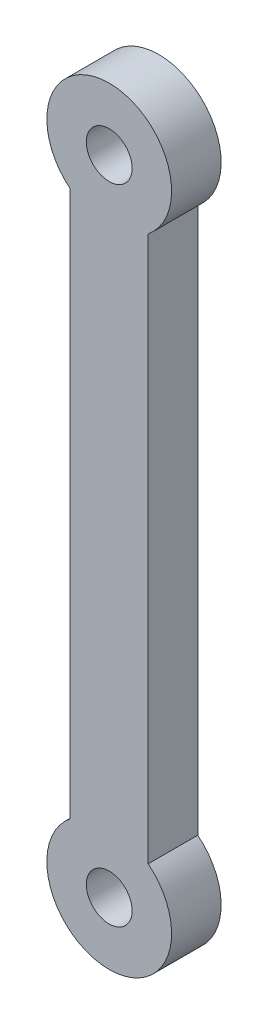
ISO-10303-21;
HEADER;
FILE_DESCRIPTION(('STEP AP214'),'2;1');
FILE_NAME('part.step','',(''),(''),'','','');
FILE_SCHEMA(('AUTOMOTIVE_DESIGN { 1 0 10303 214 1 1 1 1 }'));
ENDSEC;
DATA;
#1=APPLICATION_CONTEXT('core data for automotive mechanical design processes');
#2=APPLICATION_PROTOCOL_DEFINITION('international standard','automotive_design',2000,#1);
#3=PRODUCT_CONTEXT('',#1,'mechanical');
#4=PRODUCT('Part','Part','',(#3));
#5=PRODUCT_RELATED_PRODUCT_CATEGORY('part','',(#4));
#6=PRODUCT_DEFINITION_FORMATION('','',#4);
#7=PRODUCT_DEFINITION_CONTEXT('part definition',#1,'design');
#8=PRODUCT_DEFINITION('design','',#6,#7);
#9=PRODUCT_DEFINITION_SHAPE('','',#8);
#10=(LENGTH_UNIT() NAMED_UNIT(*) SI_UNIT(.MILLI.,.METRE.));
#11=(NAMED_UNIT(*) PLANE_ANGLE_UNIT() SI_UNIT($,.RADIAN.));
#12=(NAMED_UNIT(*) SI_UNIT($,.STERADIAN.) SOLID_ANGLE_UNIT());
#13=UNCERTAINTY_MEASURE_WITH_UNIT(LENGTH_MEASURE(1.E-05),#10,'distance_accuracy_value','');
#14=(GEOMETRIC_REPRESENTATION_CONTEXT(3) GLOBAL_UNCERTAINTY_ASSIGNED_CONTEXT((#13)) GLOBAL_UNIT_ASSIGNED_CONTEXT((#10,
#11,#12)) REPRESENTATION_CONTEXT('',''));
#15=CARTESIAN_POINT('',(0.,0.,0.));
#16=DIRECTION('',(0.,0.,1.));
#17=DIRECTION('',(1.,0.,0.));
#18=AXIS2_PLACEMENT_3D('',#15,#16,#17);
#19=CARTESIAN_POINT('',(0.,0.,3.18));
#20=DIRECTION('',(0.,0.,-1.));
#21=DIRECTION('',(-1.,0.,0.));
#22=AXIS2_PLACEMENT_3D('',#19,#20,#21);
#23=PLANE('',#22);
#24=CARTESIAN_POINT('',(0.,0.,3.18));
#25=DIRECTION('',(0.,0.,1.));
#26=DIRECTION('',(-1.,0.,0.));
#27=AXIS2_PLACEMENT_3D('',#24,#25,#26);
#28=CIRCLE('',#27,4.);
#29=CARTESIAN_POINT('',(-2.5,3.1224989991992,3.18));
#30=VERTEX_POINT('',#29);
#31=CARTESIAN_POINT('',(2.5,3.1224989991992,3.18));
#32=VERTEX_POINT('',#31);
#33=EDGE_CURVE('E50',#30,#32,#28,.T.);
#34=ORIENTED_EDGE('',*,*,#33,.T.);
#35=DIRECTION('',(0.,1.,0.));
#36=VECTOR('',#35,1.);
#37=CARTESIAN_POINT('',(2.5,3.1224989991992,3.18));
#38=LINE('',#37,#36);
#39=CARTESIAN_POINT('',(2.5,38.1224989991992,3.18));
#40=VERTEX_POINT('',#39);
#41=EDGE_CURVE('E80',#32,#40,#38,.T.);
#42=ORIENTED_EDGE('',*,*,#41,.T.);
#43=CARTESIAN_POINT('',(0.,41.2449979983984,3.18));
#44=DIRECTION('',(0.,0.,1.));
#45=DIRECTION('',(1.,0.,0.));
#46=AXIS2_PLACEMENT_3D('',#43,#44,#45);
#47=CIRCLE('',#46,4.);
#48=CARTESIAN_POINT('',(-2.5,38.1224989991992,3.18));
#49=VERTEX_POINT('',#48);
#50=EDGE_CURVE('E84',#40,#49,#47,.T.);
#51=ORIENTED_EDGE('',*,*,#50,.T.);
#52=DIRECTION('',(0.,-1.,0.));
#53=VECTOR('',#52,1.);
#54=CARTESIAN_POINT('',(-2.5,3.1224989991992,3.18));
#55=LINE('',#54,#53);
#56=EDGE_CURVE('E92',#49,#30,#55,.T.);
#57=ORIENTED_EDGE('',*,*,#56,.T.);
#58=EDGE_LOOP('',(#34,#42,#51,#57));
#59=FACE_BOUND('',#58,.T.);
#60=CARTESIAN_POINT('',(0.,41.2449979983984,3.18));
#61=DIRECTION('',(0.,0.,1.));
#62=DIRECTION('',(1.,0.,0.));
#63=AXIS2_PLACEMENT_3D('',#60,#61,#62);
#64=CIRCLE('',#63,1.47);
#65=CARTESIAN_POINT('',(-1.47,41.2449979983984,3.18));
#66=VERTEX_POINT('',#65);
#67=EDGE_CURVE('E99',#66,#66,#64,.T.);
#68=ORIENTED_EDGE('',*,*,#67,.F.);
#69=EDGE_LOOP('',(#68));
#70=FACE_BOUND('',#69,.T.);
#71=CARTESIAN_POINT('',(0.,0.,3.18));
#72=DIRECTION('',(0.,0.,1.));
#73=DIRECTION('',(1.,0.,0.));
#74=AXIS2_PLACEMENT_3D('',#71,#72,#73);
#75=CIRCLE('',#74,1.47);
#76=CARTESIAN_POINT('',(-1.47,0.,3.18));
#77=VERTEX_POINT('',#76);
#78=EDGE_CURVE('E137',#77,#77,#75,.T.);
#79=ORIENTED_EDGE('',*,*,#78,.F.);
#80=EDGE_LOOP('',(#79));
#81=FACE_BOUND('',#80,.T.);
#82=ADVANCED_FACE('F33',(#59,#70,#81),#23,.F.);
#83=CARTESIAN_POINT('',(0.,0.,0.));
#84=DIRECTION('',(0.,0.,-1.));
#85=DIRECTION('',(-1.,0.,0.));
#86=AXIS2_PLACEMENT_3D('',#83,#84,#85);
#87=PLANE('',#86);
#88=CARTESIAN_POINT('',(0.,41.2449979983984,0.));
#89=DIRECTION('',(0.,0.,1.));
#90=DIRECTION('',(1.,0.,0.));
#91=AXIS2_PLACEMENT_3D('',#88,#89,#90);
#92=CIRCLE('',#91,1.47);
#93=CARTESIAN_POINT('',(-1.47,41.2449979983984,0.));
#94=VERTEX_POINT('',#93);
#95=EDGE_CURVE('E142',#94,#94,#92,.T.);
#96=ORIENTED_EDGE('',*,*,#95,.T.);
#97=EDGE_LOOP('',(#96));
#98=FACE_BOUND('',#97,.T.);
#99=DIRECTION('',(0.,1.,0.));
#100=VECTOR('',#99,1.);
#101=CARTESIAN_POINT('',(2.5,3.1224989991992,0.));
#102=LINE('',#101,#100);
#103=CARTESIAN_POINT('',(2.5,3.1224989991992,0.));
#104=VERTEX_POINT('',#103);
#105=CARTESIAN_POINT('',(2.5,38.1224989991992,0.));
#106=VERTEX_POINT('',#105);
#107=EDGE_CURVE('E88',#104,#106,#102,.T.);
#108=ORIENTED_EDGE('',*,*,#107,.F.);
#109=CARTESIAN_POINT('',(0.,0.,0.));
#110=DIRECTION('',(0.,0.,1.));
#111=DIRECTION('',(1.,0.,0.));
#112=AXIS2_PLACEMENT_3D('',#109,#110,#111);
#113=CIRCLE('',#112,4.);
#114=CARTESIAN_POINT('',(-2.5,3.1224989991992,0.));
#115=VERTEX_POINT('',#114);
#116=EDGE_CURVE('E102',#115,#104,#113,.T.);
#117=ORIENTED_EDGE('',*,*,#116,.F.);
#118=DIRECTION('',(0.,-1.,0.));
#119=VECTOR('',#118,1.);
#120=CARTESIAN_POINT('',(-2.5,3.1224989991992,0.));
#121=LINE('',#120,#119);
#122=CARTESIAN_POINT('',(-2.5,38.1224989991992,0.));
#123=VERTEX_POINT('',#122);
#124=EDGE_CURVE('E75',#123,#115,#121,.T.);
#125=ORIENTED_EDGE('',*,*,#124,.F.);
#126=CARTESIAN_POINT('',(0.,41.2449979983984,0.));
#127=DIRECTION('',(0.,0.,1.));
#128=DIRECTION('',(1.,0.,0.));
#129=AXIS2_PLACEMENT_3D('',#126,#127,#128);
#130=CIRCLE('',#129,4.);
#131=EDGE_CURVE('E68',#106,#123,#130,.T.);
#132=ORIENTED_EDGE('',*,*,#131,.F.);
#133=EDGE_LOOP('',(#108,#117,#125,#132));
#134=FACE_BOUND('',#133,.T.);
#135=CARTESIAN_POINT('',(0.,0.,0.));
#136=DIRECTION('',(0.,0.,1.));
#137=DIRECTION('',(1.,0.,0.));
#138=AXIS2_PLACEMENT_3D('',#135,#136,#137);
#139=CIRCLE('',#138,1.47);
#140=CARTESIAN_POINT('',(-1.47,0.,0.));
#141=VERTEX_POINT('',#140);
#142=EDGE_CURVE('E140',#141,#141,#139,.T.);
#143=ORIENTED_EDGE('',*,*,#142,.T.);
#144=EDGE_LOOP('',(#143));
#145=FACE_BOUND('',#144,.T.);
#146=ADVANCED_FACE('F108',(#98,#134,#145),#87,.T.);
#147=CARTESIAN_POINT('',(2.5,3.1224989991992,3.18));
#148=DIRECTION('',(-1.,0.,0.));
#149=DIRECTION('',(0.,-1.,0.));
#150=AXIS2_PLACEMENT_3D('',#147,#148,#149);
#151=PLANE('',#150);
#152=ORIENTED_EDGE('',*,*,#107,.T.);
#153=DIRECTION('',(0.,0.,-1.));
#154=VECTOR('',#153,1.);
#155=CARTESIAN_POINT('',(2.5,38.1224989991992,3.18));
#156=LINE('',#155,#154);
#157=EDGE_CURVE('E42',#40,#106,#156,.T.);
#158=ORIENTED_EDGE('',*,*,#157,.F.);
#159=ORIENTED_EDGE('',*,*,#41,.F.);
#160=DIRECTION('',(0.,0.,-1.));
#161=VECTOR('',#160,1.);
#162=CARTESIAN_POINT('',(2.5,3.1224989991992,3.18));
#163=LINE('',#162,#161);
#164=EDGE_CURVE('E11',#32,#104,#163,.T.);
#165=ORIENTED_EDGE('',*,*,#164,.T.);
#166=EDGE_LOOP('',(#152,#158,#159,#165));
#167=FACE_BOUND('',#166,.T.);
#168=ADVANCED_FACE('F35',(#167),#151,.F.);
#169=CARTESIAN_POINT('',(0.,41.2449979983984,3.18));
#170=DIRECTION('',(0.,0.,-1.));
#171=DIRECTION('',(-1.,0.,0.));
#172=AXIS2_PLACEMENT_3D('',#169,#170,#171);
#173=CYLINDRICAL_SURFACE('',#172,4.);
#174=ORIENTED_EDGE('',*,*,#131,.T.);
#175=DIRECTION('',(0.,0.,-1.));
#176=VECTOR('',#175,1.);
#177=CARTESIAN_POINT('',(-2.5,38.1224989991992,3.18));
#178=LINE('',#177,#176);
#179=EDGE_CURVE('E89',#49,#123,#178,.T.);
#180=ORIENTED_EDGE('',*,*,#179,.F.);
#181=ORIENTED_EDGE('',*,*,#50,.F.);
#182=ORIENTED_EDGE('',*,*,#157,.T.);
#183=EDGE_LOOP('',(#174,#180,#181,#182));
#184=FACE_BOUND('',#183,.T.);
#185=ADVANCED_FACE('F90',(#184),#173,.T.);
#186=CARTESIAN_POINT('',(-2.5,3.1224989991992,3.18));
#187=DIRECTION('',(1.,0.,0.));
#188=DIRECTION('',(0.,1.,0.));
#189=AXIS2_PLACEMENT_3D('',#186,#187,#188);
#190=PLANE('',#189);
#191=ORIENTED_EDGE('',*,*,#124,.T.);
#192=DIRECTION('',(0.,0.,-1.));
#193=VECTOR('',#192,1.);
#194=CARTESIAN_POINT('',(-2.5,3.1224989991992,3.18));
#195=LINE('',#194,#193);
#196=EDGE_CURVE('E94',#30,#115,#195,.T.);
#197=ORIENTED_EDGE('',*,*,#196,.F.);
#198=ORIENTED_EDGE('',*,*,#56,.F.);
#199=ORIENTED_EDGE('',*,*,#179,.T.);
#200=EDGE_LOOP('',(#191,#197,#198,#199));
#201=FACE_BOUND('',#200,.T.);
#202=ADVANCED_FACE('F105',(#201),#190,.F.);
#203=CARTESIAN_POINT('',(0.,0.,3.18));
#204=DIRECTION('',(0.,0.,-1.));
#205=DIRECTION('',(-1.,0.,0.));
#206=AXIS2_PLACEMENT_3D('',#203,#204,#205);
#207=CYLINDRICAL_SURFACE('',#206,4.);
#208=ORIENTED_EDGE('',*,*,#116,.T.);
#209=ORIENTED_EDGE('',*,*,#164,.F.);
#210=ORIENTED_EDGE('',*,*,#33,.F.);
#211=ORIENTED_EDGE('',*,*,#196,.T.);
#212=EDGE_LOOP('',(#208,#209,#210,#211));
#213=FACE_BOUND('',#212,.T.);
#214=ADVANCED_FACE('F110',(#213),#207,.T.);
#215=CARTESIAN_POINT('',(0.,41.2449979983984,3.18));
#216=DIRECTION('',(0.,0.,-1.));
#217=DIRECTION('',(-1.,0.,0.));
#218=AXIS2_PLACEMENT_3D('',#215,#216,#217);
#219=CYLINDRICAL_SURFACE('',#218,1.47);
#220=CARTESIAN_POINT('',(-1.47,41.2449979983984,3.18));
#221=CARTESIAN_POINT('',(-1.47,41.2449979983984,3.146875));
#222=CARTESIAN_POINT('',(-1.47,41.2449979983984,3.11375));
#223=CARTESIAN_POINT('',(-1.47,41.2449979983984,3.0475));
#224=CARTESIAN_POINT('',(-1.47,41.2449979983984,3.014375));
#225=CARTESIAN_POINT('',(-1.47,41.2449979983984,2.948125));
#226=CARTESIAN_POINT('',(-1.47,41.2449979983984,2.915));
#227=CARTESIAN_POINT('',(-1.47,41.2449979983984,2.84875));
#228=CARTESIAN_POINT('',(-1.47,41.2449979983984,2.815625));
#229=CARTESIAN_POINT('',(-1.47,41.2449979983984,2.749375));
#230=CARTESIAN_POINT('',(-1.47,41.2449979983984,2.71625));
#231=CARTESIAN_POINT('',(-1.47,41.2449979983984,2.65));
#232=CARTESIAN_POINT('',(-1.47,41.2449979983984,2.616875));
#233=CARTESIAN_POINT('',(-1.47,41.2449979983984,2.550625));
#234=CARTESIAN_POINT('',(-1.47,41.2449979983984,2.5175));
#235=CARTESIAN_POINT('',(-1.47,41.2449979983984,2.45125));
#236=CARTESIAN_POINT('',(-1.47,41.2449979983984,2.418125));
#237=CARTESIAN_POINT('',(-1.47,41.2449979983984,2.351875));
#238=CARTESIAN_POINT('',(-1.47,41.2449979983984,2.31875));
#239=CARTESIAN_POINT('',(-1.47,41.2449979983984,2.2525));
#240=CARTESIAN_POINT('',(-1.47,41.2449979983984,2.219375));
#241=CARTESIAN_POINT('',(-1.47,41.2449979983984,2.153125));
#242=CARTESIAN_POINT('',(-1.47,41.2449979983984,2.12));
#243=CARTESIAN_POINT('',(-1.47,41.2449979983984,2.05375));
#244=CARTESIAN_POINT('',(-1.47,41.2449979983984,2.020625));
#245=CARTESIAN_POINT('',(-1.47,41.2449979983984,1.954375));
#246=CARTESIAN_POINT('',(-1.47,41.2449979983984,1.92125));
#247=CARTESIAN_POINT('',(-1.47,41.2449979983984,1.855));
#248=CARTESIAN_POINT('',(-1.47,41.2449979983984,1.821875));
#249=CARTESIAN_POINT('',(-1.47,41.2449979983984,1.755625));
#250=CARTESIAN_POINT('',(-1.47,41.2449979983984,1.7225));
#251=CARTESIAN_POINT('',(-1.47,41.2449979983984,1.65625));
#252=CARTESIAN_POINT('',(-1.47,41.2449979983984,1.623125));
#253=CARTESIAN_POINT('',(-1.47,41.2449979983984,1.556875));
#254=CARTESIAN_POINT('',(-1.47,41.2449979983984,1.52375));
#255=CARTESIAN_POINT('',(-1.47,41.2449979983984,1.4575));
#256=CARTESIAN_POINT('',(-1.47,41.2449979983984,1.424375));
#257=CARTESIAN_POINT('',(-1.47,41.2449979983984,1.358125));
#258=CARTESIAN_POINT('',(-1.47,41.2449979983984,1.325));
#259=CARTESIAN_POINT('',(-1.47,41.2449979983984,1.25875));
#260=CARTESIAN_POINT('',(-1.47,41.2449979983984,1.225625));
#261=CARTESIAN_POINT('',(-1.47,41.2449979983984,1.159375));
#262=CARTESIAN_POINT('',(-1.47,41.2449979983984,1.12625));
#263=CARTESIAN_POINT('',(-1.47,41.2449979983984,1.06));
#264=CARTESIAN_POINT('',(-1.47,41.2449979983984,1.026875));
#265=CARTESIAN_POINT('',(-1.47,41.2449979983984,0.960625));
#266=CARTESIAN_POINT('',(-1.47,41.2449979983984,0.9275));
#267=CARTESIAN_POINT('',(-1.47,41.2449979983984,0.86125));
#268=CARTESIAN_POINT('',(-1.47,41.2449979983984,0.828125));
#269=CARTESIAN_POINT('',(-1.47,41.2449979983984,0.761875));
#270=CARTESIAN_POINT('',(-1.47,41.2449979983984,0.72875));
#271=CARTESIAN_POINT('',(-1.47,41.2449979983984,0.6625));
#272=CARTESIAN_POINT('',(-1.47,41.2449979983984,0.629375));
#273=CARTESIAN_POINT('',(-1.47,41.2449979983984,0.563125));
#274=CARTESIAN_POINT('',(-1.47,41.2449979983984,0.53));
#275=CARTESIAN_POINT('',(-1.47,41.2449979983984,0.46375));
#276=CARTESIAN_POINT('',(-1.47,41.2449979983984,0.430625));
#277=CARTESIAN_POINT('',(-1.47,41.2449979983984,0.364375));
#278=CARTESIAN_POINT('',(-1.47,41.2449979983984,0.33125));
#279=CARTESIAN_POINT('',(-1.47,41.2449979983984,0.265));
#280=CARTESIAN_POINT('',(-1.47,41.2449979983984,0.231875));
#281=CARTESIAN_POINT('',(-1.47,41.2449979983984,0.165625));
#282=CARTESIAN_POINT('',(-1.47,41.2449979983984,0.1325));
#283=CARTESIAN_POINT('',(-1.47,41.2449979983984,0.06625));
#284=CARTESIAN_POINT('',(-1.47,41.2449979983984,0.033125));
#285=CARTESIAN_POINT('',(-1.47,41.2449979983984,0.));
#286=B_SPLINE_CURVE_WITH_KNOTS('',3,(#220,#221,#222,#223,#224,#225,#226,#227,#228,#229,#230,
#231,#232,#233,#234,#235,#236,#237,#238,#239,#240,#241,#242,#243,#244,#245,#246,#247,#248,#249,
#250,#251,#252,#253,#254,#255,#256,#257,#258,#259,#260,#261,#262,#263,#264,#265,#266,#267,#268,
#269,#270,#271,#272,#273,#274,#275,#276,#277,#278,#279,#280,#281,#282,#283,#284,#285),
.UNSPECIFIED.,.F.,.F.,(4,2,2,2,2,2,2,2,2,2,2,2,2,2,2,2,2,2,2,2,2,2,2,2,2,2,2,2,2,2,2,2,4),(0.,
0.0993750000000001,0.19875,0.298125,0.3975,0.496875,0.59625,0.695625,0.795,0.894375,0.99375,
1.093125,1.1925,1.291875,1.39125,1.490625,1.59,1.689375,1.78875,1.888125,1.9875,2.086875,
2.18625,2.285625,2.385,2.484375,2.58375,2.683125,2.7825,2.881875,2.98125,3.080625,3.18),.UNSPECIFIED.);
#287=EDGE_CURVE('BSEAM112',#66,#94,#286,.T.);
#288=ORIENTED_EDGE('',*,*,#67,.T.);
#289=ORIENTED_EDGE('',*,*,#95,.F.);
#290=ORIENTED_EDGE('',*,*,#287,.T.);
#291=ORIENTED_EDGE('',*,*,#287,.F.);
#292=EDGE_LOOP('',(#288,#290,#289,#291));
#293=FACE_BOUND('',#292,.T.);
#294=ADVANCED_FACE('F112',(#293),#219,.F.);
#295=CARTESIAN_POINT('',(0.,0.,3.18));
#296=DIRECTION('',(0.,0.,-1.));
#297=DIRECTION('',(-1.,0.,0.));
#298=AXIS2_PLACEMENT_3D('',#295,#296,#297);
#299=CYLINDRICAL_SURFACE('',#298,1.47);
#300=CARTESIAN_POINT('',(-1.47,0.,3.18));
#301=CARTESIAN_POINT('',(-1.47,0.,3.146875));
#302=CARTESIAN_POINT('',(-1.47,0.,3.11375));
#303=CARTESIAN_POINT('',(-1.47,0.,3.0475));
#304=CARTESIAN_POINT('',(-1.47,0.,3.014375));
#305=CARTESIAN_POINT('',(-1.47,0.,2.948125));
#306=CARTESIAN_POINT('',(-1.47,0.,2.915));
#307=CARTESIAN_POINT('',(-1.47,0.,2.84875));
#308=CARTESIAN_POINT('',(-1.47,0.,2.815625));
#309=CARTESIAN_POINT('',(-1.47,0.,2.749375));
#310=CARTESIAN_POINT('',(-1.47,0.,2.71625));
#311=CARTESIAN_POINT('',(-1.47,0.,2.65));
#312=CARTESIAN_POINT('',(-1.47,0.,2.616875));
#313=CARTESIAN_POINT('',(-1.47,0.,2.550625));
#314=CARTESIAN_POINT('',(-1.47,0.,2.5175));
#315=CARTESIAN_POINT('',(-1.47,0.,2.45125));
#316=CARTESIAN_POINT('',(-1.47,0.,2.418125));
#317=CARTESIAN_POINT('',(-1.47,0.,2.351875));
#318=CARTESIAN_POINT('',(-1.47,0.,2.31875));
#319=CARTESIAN_POINT('',(-1.47,0.,2.2525));
#320=CARTESIAN_POINT('',(-1.47,0.,2.219375));
#321=CARTESIAN_POINT('',(-1.47,0.,2.153125));
#322=CARTESIAN_POINT('',(-1.47,0.,2.12));
#323=CARTESIAN_POINT('',(-1.47,0.,2.05375));
#324=CARTESIAN_POINT('',(-1.47,0.,2.020625));
#325=CARTESIAN_POINT('',(-1.47,0.,1.954375));
#326=CARTESIAN_POINT('',(-1.47,0.,1.92125));
#327=CARTESIAN_POINT('',(-1.47,0.,1.855));
#328=CARTESIAN_POINT('',(-1.47,0.,1.821875));
#329=CARTESIAN_POINT('',(-1.47,0.,1.755625));
#330=CARTESIAN_POINT('',(-1.47,0.,1.7225));
#331=CARTESIAN_POINT('',(-1.47,0.,1.65625));
#332=CARTESIAN_POINT('',(-1.47,0.,1.623125));
#333=CARTESIAN_POINT('',(-1.47,0.,1.556875));
#334=CARTESIAN_POINT('',(-1.47,0.,1.52375));
#335=CARTESIAN_POINT('',(-1.47,0.,1.4575));
#336=CARTESIAN_POINT('',(-1.47,0.,1.424375));
#337=CARTESIAN_POINT('',(-1.47,0.,1.358125));
#338=CARTESIAN_POINT('',(-1.47,0.,1.325));
#339=CARTESIAN_POINT('',(-1.47,0.,1.25875));
#340=CARTESIAN_POINT('',(-1.47,0.,1.225625));
#341=CARTESIAN_POINT('',(-1.47,0.,1.159375));
#342=CARTESIAN_POINT('',(-1.47,0.,1.12625));
#343=CARTESIAN_POINT('',(-1.47,0.,1.06));
#344=CARTESIAN_POINT('',(-1.47,0.,1.026875));
#345=CARTESIAN_POINT('',(-1.47,0.,0.960625));
#346=CARTESIAN_POINT('',(-1.47,0.,0.9275));
#347=CARTESIAN_POINT('',(-1.47,0.,0.86125));
#348=CARTESIAN_POINT('',(-1.47,0.,0.828125));
#349=CARTESIAN_POINT('',(-1.47,0.,0.761875));
#350=CARTESIAN_POINT('',(-1.47,0.,0.72875));
#351=CARTESIAN_POINT('',(-1.47,0.,0.6625));
#352=CARTESIAN_POINT('',(-1.47,0.,0.629375));
#353=CARTESIAN_POINT('',(-1.47,0.,0.563125));
#354=CARTESIAN_POINT('',(-1.47,0.,0.53));
#355=CARTESIAN_POINT('',(-1.47,0.,0.46375));
#356=CARTESIAN_POINT('',(-1.47,0.,0.430625));
#357=CARTESIAN_POINT('',(-1.47,0.,0.364375));
#358=CARTESIAN_POINT('',(-1.47,0.,0.33125));
#359=CARTESIAN_POINT('',(-1.47,0.,0.265));
#360=CARTESIAN_POINT('',(-1.47,0.,0.231875));
#361=CARTESIAN_POINT('',(-1.47,0.,0.165625));
#362=CARTESIAN_POINT('',(-1.47,0.,0.1325));
#363=CARTESIAN_POINT('',(-1.47,0.,0.06625));
#364=CARTESIAN_POINT('',(-1.47,0.,0.033125));
#365=CARTESIAN_POINT('',(-1.47,0.,0.));
#366=B_SPLINE_CURVE_WITH_KNOTS('',3,(#300,#301,#302,#303,#304,#305,#306,#307,#308,#309,#310,
#311,#312,#313,#314,#315,#316,#317,#318,#319,#320,#321,#322,#323,#324,#325,#326,#327,#328,#329,
#330,#331,#332,#333,#334,#335,#336,#337,#338,#339,#340,#341,#342,#343,#344,#345,#346,#347,#348,
#349,#350,#351,#352,#353,#354,#355,#356,#357,#358,#359,#360,#361,#362,#363,#364,#365),
.UNSPECIFIED.,.F.,.F.,(4,2,2,2,2,2,2,2,2,2,2,2,2,2,2,2,2,2,2,2,2,2,2,2,2,2,2,2,2,2,2,2,4),(0.,
0.0993750000000001,0.19875,0.298125,0.3975,0.496875,0.59625,0.695625,0.795,0.894375,0.99375,
1.093125,1.1925,1.291875,1.39125,1.490625,1.59,1.689375,1.78875,1.888125,1.9875,2.086875,
2.18625,2.285625,2.385,2.484375,2.58375,2.683125,2.7825,2.881875,2.98125,3.080625,3.18),.UNSPECIFIED.);
#367=EDGE_CURVE('BSEAM118',#77,#141,#366,.T.);
#368=ORIENTED_EDGE('',*,*,#78,.T.);
#369=ORIENTED_EDGE('',*,*,#142,.F.);
#370=ORIENTED_EDGE('',*,*,#367,.T.);
#371=ORIENTED_EDGE('',*,*,#367,.F.);
#372=EDGE_LOOP('',(#368,#370,#369,#371));
#373=FACE_BOUND('',#372,.T.);
#374=ADVANCED_FACE('F118',(#373),#299,.F.);
#375=CLOSED_SHELL('',(#82,#146,#168,#185,#202,#214,#294,#374));
#376=MANIFOLD_SOLID_BREP('B2',#375);
#377=ADVANCED_BREP_SHAPE_REPRESENTATION('',(#18,#376),#14);
#378=SHAPE_DEFINITION_REPRESENTATION(#9,#377);
ENDSEC;
END-ISO-10303-21;
